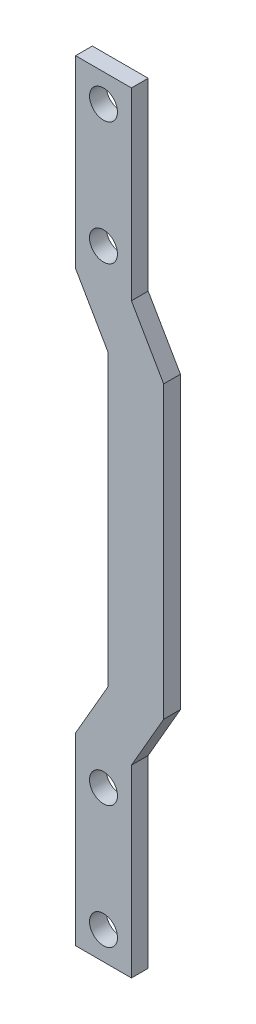
ISO-10303-21;
HEADER;
FILE_DESCRIPTION(('STEP AP214'),'2;1');
FILE_NAME('part.step','',(''),(''),'','','');
FILE_SCHEMA(('AUTOMOTIVE_DESIGN { 1 0 10303 214 1 1 1 1 }'));
ENDSEC;
DATA;
#1=APPLICATION_CONTEXT('core data for automotive mechanical design processes');
#2=APPLICATION_PROTOCOL_DEFINITION('international standard','automotive_design',2000,#1);
#3=PRODUCT_CONTEXT('',#1,'mechanical');
#4=PRODUCT('Part','Part','',(#3));
#5=PRODUCT_RELATED_PRODUCT_CATEGORY('part','',(#4));
#6=PRODUCT_DEFINITION_FORMATION('','',#4);
#7=PRODUCT_DEFINITION_CONTEXT('part definition',#1,'design');
#8=PRODUCT_DEFINITION('design','',#6,#7);
#9=PRODUCT_DEFINITION_SHAPE('','',#8);
#10=(LENGTH_UNIT() NAMED_UNIT(*) SI_UNIT(.MILLI.,.METRE.));
#11=(NAMED_UNIT(*) PLANE_ANGLE_UNIT() SI_UNIT($,.RADIAN.));
#12=(NAMED_UNIT(*) SI_UNIT($,.STERADIAN.) SOLID_ANGLE_UNIT());
#13=UNCERTAINTY_MEASURE_WITH_UNIT(LENGTH_MEASURE(1.E-05),#10,'distance_accuracy_value','');
#14=(GEOMETRIC_REPRESENTATION_CONTEXT(3) GLOBAL_UNCERTAINTY_ASSIGNED_CONTEXT((#13)) GLOBAL_UNIT_ASSIGNED_CONTEXT((#10,
#11,#12)) REPRESENTATION_CONTEXT('',''));
#15=CARTESIAN_POINT('',(0.,0.,0.));
#16=DIRECTION('',(0.,0.,1.));
#17=DIRECTION('',(1.,0.,0.));
#18=AXIS2_PLACEMENT_3D('',#15,#16,#17);
#19=CARTESIAN_POINT('',(0.,0.,3.));
#20=DIRECTION('',(0.,0.,1.));
#21=DIRECTION('',(1.,0.,0.));
#22=AXIS2_PLACEMENT_3D('',#19,#20,#21);
#23=PLANE('',#22);
#24=CARTESIAN_POINT('',(-105.080131723381,-47.7357142857143,3.));
#25=DIRECTION('',(0.,0.,1.));
#26=DIRECTION('',(-1.,0.,0.));
#27=AXIS2_PLACEMENT_3D('',#24,#25,#26);
#28=CIRCLE('',#27,2.5);
#29=CARTESIAN_POINT('',(-107.580131723381,-47.7357142857143,3.));
#30=VERTEX_POINT('',#29);
#31=EDGE_CURVE('E290',#30,#30,#28,.T.);
#32=ORIENTED_EDGE('',*,*,#31,.F.);
#33=EDGE_LOOP('',(#32));
#34=FACE_BOUND('',#33,.T.);
#35=CARTESIAN_POINT('',(-105.080131723381,58.2642857142857,3.));
#36=DIRECTION('',(0.,0.,1.));
#37=DIRECTION('',(1.,0.,0.));
#38=AXIS2_PLACEMENT_3D('',#35,#36,#37);
#39=CIRCLE('',#38,2.5);
#40=CARTESIAN_POINT('',(-102.580131723381,58.2642857142857,3.));
#41=VERTEX_POINT('',#40);
#42=EDGE_CURVE('E157',#41,#41,#39,.T.);
#43=ORIENTED_EDGE('',*,*,#42,.F.);
#44=EDGE_LOOP('',(#43));
#45=FACE_BOUND('',#44,.T.);
#46=DIRECTION('',(-0.499999999999999,0.866025403784439,0.));
#47=VECTOR('',#46,1.);
#48=CARTESIAN_POINT('',(-100.080131723381,30.2642857142857,3.));
#49=LINE('',#48,#47);
#50=CARTESIAN_POINT('',(-94.3066290314847,20.2642857142857,3.));
#51=VERTEX_POINT('',#50);
#52=CARTESIAN_POINT('',(-100.080131723381,30.2642857142857,3.));
#53=VERTEX_POINT('',#52);
#54=EDGE_CURVE('E176',#51,#53,#49,.T.);
#55=ORIENTED_EDGE('',*,*,#54,.T.);
#56=DIRECTION('',(0.,1.,0.));
#57=VECTOR('',#56,1.);
#58=CARTESIAN_POINT('',(-100.080131723381,30.2642857142857,3.));
#59=LINE('',#58,#57);
#60=CARTESIAN_POINT('',(-100.080131723381,63.2642857142857,3.));
#61=VERTEX_POINT('',#60);
#62=EDGE_CURVE('E104',#53,#61,#59,.T.);
#63=ORIENTED_EDGE('',*,*,#62,.T.);
#64=DIRECTION('',(-1.,0.,0.));
#65=VECTOR('',#64,1.);
#66=CARTESIAN_POINT('',(-100.080131723381,63.2642857142857,3.));
#67=LINE('',#66,#65);
#68=CARTESIAN_POINT('',(-110.080131723381,63.2642857142857,3.));
#69=VERTEX_POINT('',#68);
#70=EDGE_CURVE('E203',#61,#69,#67,.T.);
#71=ORIENTED_EDGE('',*,*,#70,.T.);
#72=DIRECTION('',(0.,-1.,0.));
#73=VECTOR('',#72,1.);
#74=CARTESIAN_POINT('',(-110.080131723381,30.2642857142857,3.));
#75=LINE('',#74,#73);
#76=CARTESIAN_POINT('',(-110.080131723381,30.2642857142857,3.));
#77=VERTEX_POINT('',#76);
#78=EDGE_CURVE('E222',#69,#77,#75,.T.);
#79=ORIENTED_EDGE('',*,*,#78,.T.);
#80=DIRECTION('',(0.499999999999995,-0.866025403784442,0.));
#81=VECTOR('',#80,1.);
#82=CARTESIAN_POINT('',(-110.080131723381,30.2642857142857,3.));
#83=LINE('',#82,#81);
#84=CARTESIAN_POINT('',(-104.306629031485,20.2642857142857,3.));
#85=VERTEX_POINT('',#84);
#86=EDGE_CURVE('E219',#77,#85,#83,.T.);
#87=ORIENTED_EDGE('',*,*,#86,.T.);
#88=DIRECTION('',(0.,-1.,0.));
#89=VECTOR('',#88,1.);
#90=CARTESIAN_POINT('',(-104.306629031485,20.2642857142857,3.));
#91=LINE('',#90,#89);
#92=CARTESIAN_POINT('',(-104.306629031485,-31.7357142857143,3.));
#93=VERTEX_POINT('',#92);
#94=EDGE_CURVE('E221',#85,#93,#91,.T.);
#95=ORIENTED_EDGE('',*,*,#94,.T.);
#96=DIRECTION('',(-0.499999999999995,-0.866025403784442,0.));
#97=VECTOR('',#96,1.);
#98=CARTESIAN_POINT('',(-110.080131723381,-41.7357142857143,3.));
#99=LINE('',#98,#97);
#100=CARTESIAN_POINT('',(-110.080131723381,-41.7357142857143,3.));
#101=VERTEX_POINT('',#100);
#102=EDGE_CURVE('E224',#93,#101,#99,.T.);
#103=ORIENTED_EDGE('',*,*,#102,.T.);
#104=DIRECTION('',(0.,-1.,0.));
#105=VECTOR('',#104,1.);
#106=CARTESIAN_POINT('',(-110.080131723381,-41.7357142857143,3.));
#107=LINE('',#106,#105);
#108=CARTESIAN_POINT('',(-110.080131723381,-74.7357142857143,3.));
#109=VERTEX_POINT('',#108);
#110=EDGE_CURVE('E230',#101,#109,#107,.T.);
#111=ORIENTED_EDGE('',*,*,#110,.T.);
#112=DIRECTION('',(1.,0.,0.));
#113=VECTOR('',#112,1.);
#114=CARTESIAN_POINT('',(-100.080131723381,-74.7357142857143,3.));
#115=LINE('',#114,#113);
#116=CARTESIAN_POINT('',(-100.080131723381,-74.7357142857143,3.));
#117=VERTEX_POINT('',#116);
#118=EDGE_CURVE('E135',#109,#117,#115,.T.);
#119=ORIENTED_EDGE('',*,*,#118,.T.);
#120=DIRECTION('',(0.,1.,0.));
#121=VECTOR('',#120,1.);
#122=CARTESIAN_POINT('',(-100.080131723381,-41.7357142857143,3.));
#123=LINE('',#122,#121);
#124=CARTESIAN_POINT('',(-100.080131723381,-41.7357142857143,3.));
#125=VERTEX_POINT('',#124);
#126=EDGE_CURVE('E129',#117,#125,#123,.T.);
#127=ORIENTED_EDGE('',*,*,#126,.T.);
#128=DIRECTION('',(0.499999999999995,0.866025403784442,0.));
#129=VECTOR('',#128,1.);
#130=CARTESIAN_POINT('',(-100.080131723381,-41.7357142857143,3.));
#131=LINE('',#130,#129);
#132=CARTESIAN_POINT('',(-94.3066290314847,-31.7357142857143,3.));
#133=VERTEX_POINT('',#132);
#134=EDGE_CURVE('E133',#125,#133,#131,.T.);
#135=ORIENTED_EDGE('',*,*,#134,.T.);
#136=DIRECTION('',(0.,1.,0.));
#137=VECTOR('',#136,1.);
#138=CARTESIAN_POINT('',(-94.3066290314847,20.2642857142857,3.));
#139=LINE('',#138,#137);
#140=EDGE_CURVE('E49',#133,#51,#139,.T.);
#141=ORIENTED_EDGE('',*,*,#140,.T.);
#142=EDGE_LOOP('',(#55,#63,#71,#79,#87,#95,#103,#111,#119,#127,#135,#141));
#143=FACE_BOUND('',#142,.T.);
#144=CARTESIAN_POINT('',(-105.080131723381,36.2642857142857,3.));
#145=DIRECTION('',(0.,0.,1.));
#146=DIRECTION('',(1.,0.,0.));
#147=AXIS2_PLACEMENT_3D('',#144,#145,#146);
#148=CIRCLE('',#147,2.5);
#149=CARTESIAN_POINT('',(-102.580131723381,36.2642857142857,3.));
#150=VERTEX_POINT('',#149);
#151=EDGE_CURVE('E296',#150,#150,#148,.T.);
#152=ORIENTED_EDGE('',*,*,#151,.F.);
#153=EDGE_LOOP('',(#152));
#154=FACE_BOUND('',#153,.T.);
#155=CARTESIAN_POINT('',(-105.080131723381,-69.7357142857143,3.));
#156=DIRECTION('',(0.,0.,1.));
#157=DIRECTION('',(-1.,0.,0.));
#158=AXIS2_PLACEMENT_3D('',#155,#156,#157);
#159=CIRCLE('',#158,2.5);
#160=CARTESIAN_POINT('',(-107.580131723381,-69.7357142857143,3.));
#161=VERTEX_POINT('',#160);
#162=EDGE_CURVE('E281',#161,#161,#159,.T.);
#163=ORIENTED_EDGE('',*,*,#162,.F.);
#164=EDGE_LOOP('',(#163));
#165=FACE_BOUND('',#164,.T.);
#166=ADVANCED_FACE('F32',(#34,#45,#143,#154,#165),#23,.T.);
#167=CARTESIAN_POINT('',(0.,0.,0.));
#168=DIRECTION('',(0.,0.,1.));
#169=DIRECTION('',(1.,0.,0.));
#170=AXIS2_PLACEMENT_3D('',#167,#168,#169);
#171=PLANE('',#170);
#172=DIRECTION('',(-0.499999999999999,0.866025403784439,0.));
#173=VECTOR('',#172,1.);
#174=CARTESIAN_POINT('',(-100.080131723381,30.2642857142857,0.));
#175=LINE('',#174,#173);
#176=CARTESIAN_POINT('',(-94.3066290314847,20.2642857142857,0.));
#177=VERTEX_POINT('',#176);
#178=CARTESIAN_POINT('',(-100.080131723381,30.2642857142857,0.));
#179=VERTEX_POINT('',#178);
#180=EDGE_CURVE('E153',#177,#179,#175,.T.);
#181=ORIENTED_EDGE('',*,*,#180,.F.);
#182=DIRECTION('',(0.,1.,0.));
#183=VECTOR('',#182,1.);
#184=CARTESIAN_POINT('',(-94.3066290314847,20.2642857142857,0.));
#185=LINE('',#184,#183);
#186=CARTESIAN_POINT('',(-94.3066290314847,-31.7357142857143,0.));
#187=VERTEX_POINT('',#186);
#188=EDGE_CURVE('E96',#187,#177,#185,.T.);
#189=ORIENTED_EDGE('',*,*,#188,.F.);
#190=DIRECTION('',(0.499999999999995,0.866025403784442,0.));
#191=VECTOR('',#190,1.);
#192=CARTESIAN_POINT('',(-100.080131723381,-41.7357142857143,0.));
#193=LINE('',#192,#191);
#194=CARTESIAN_POINT('',(-100.080131723381,-41.7357142857143,0.));
#195=VERTEX_POINT('',#194);
#196=EDGE_CURVE('E90',#195,#187,#193,.T.);
#197=ORIENTED_EDGE('',*,*,#196,.F.);
#198=DIRECTION('',(0.,1.,0.));
#199=VECTOR('',#198,1.);
#200=CARTESIAN_POINT('',(-100.080131723381,-41.7357142857143,0.));
#201=LINE('',#200,#199);
#202=CARTESIAN_POINT('',(-100.080131723381,-74.7357142857143,0.));
#203=VERTEX_POINT('',#202);
#204=EDGE_CURVE('E143',#203,#195,#201,.T.);
#205=ORIENTED_EDGE('',*,*,#204,.F.);
#206=DIRECTION('',(1.,0.,0.));
#207=VECTOR('',#206,1.);
#208=CARTESIAN_POINT('',(-100.080131723381,-74.7357142857143,0.));
#209=LINE('',#208,#207);
#210=CARTESIAN_POINT('',(-110.080131723381,-74.7357142857143,0.));
#211=VERTEX_POINT('',#210);
#212=EDGE_CURVE('E171',#211,#203,#209,.T.);
#213=ORIENTED_EDGE('',*,*,#212,.F.);
#214=DIRECTION('',(0.,-1.,0.));
#215=VECTOR('',#214,1.);
#216=CARTESIAN_POINT('',(-110.080131723381,-41.7357142857143,0.));
#217=LINE('',#216,#215);
#218=CARTESIAN_POINT('',(-110.080131723381,-41.7357142857143,0.));
#219=VERTEX_POINT('',#218);
#220=EDGE_CURVE('E169',#219,#211,#217,.T.);
#221=ORIENTED_EDGE('',*,*,#220,.F.);
#222=DIRECTION('',(-0.499999999999995,-0.866025403784442,0.));
#223=VECTOR('',#222,1.);
#224=CARTESIAN_POINT('',(-110.080131723381,-41.7357142857143,0.));
#225=LINE('',#224,#223);
#226=CARTESIAN_POINT('',(-104.306629031485,-31.7357142857143,0.));
#227=VERTEX_POINT('',#226);
#228=EDGE_CURVE('E167',#227,#219,#225,.T.);
#229=ORIENTED_EDGE('',*,*,#228,.F.);
#230=DIRECTION('',(0.,-1.,0.));
#231=VECTOR('',#230,1.);
#232=CARTESIAN_POINT('',(-104.306629031485,20.2642857142857,0.));
#233=LINE('',#232,#231);
#234=CARTESIAN_POINT('',(-104.306629031485,20.2642857142857,0.));
#235=VERTEX_POINT('',#234);
#236=EDGE_CURVE('E165',#235,#227,#233,.T.);
#237=ORIENTED_EDGE('',*,*,#236,.F.);
#238=DIRECTION('',(0.499999999999995,-0.866025403784442,0.));
#239=VECTOR('',#238,1.);
#240=CARTESIAN_POINT('',(-110.080131723381,30.2642857142857,0.));
#241=LINE('',#240,#239);
#242=CARTESIAN_POINT('',(-110.080131723381,30.2642857142857,0.));
#243=VERTEX_POINT('',#242);
#244=EDGE_CURVE('E163',#243,#235,#241,.T.);
#245=ORIENTED_EDGE('',*,*,#244,.F.);
#246=DIRECTION('',(0.,-1.,0.));
#247=VECTOR('',#246,1.);
#248=CARTESIAN_POINT('',(-110.080131723381,30.2642857142857,0.));
#249=LINE('',#248,#247);
#250=CARTESIAN_POINT('',(-110.080131723381,63.2642857142857,0.));
#251=VERTEX_POINT('',#250);
#252=EDGE_CURVE('E161',#251,#243,#249,.T.);
#253=ORIENTED_EDGE('',*,*,#252,.F.);
#254=DIRECTION('',(-1.,0.,0.));
#255=VECTOR('',#254,1.);
#256=CARTESIAN_POINT('',(-100.080131723381,63.2642857142857,0.));
#257=LINE('',#256,#255);
#258=CARTESIAN_POINT('',(-100.080131723381,63.2642857142857,0.));
#259=VERTEX_POINT('',#258);
#260=EDGE_CURVE('E159',#259,#251,#257,.T.);
#261=ORIENTED_EDGE('',*,*,#260,.F.);
#262=DIRECTION('',(0.,1.,0.));
#263=VECTOR('',#262,1.);
#264=CARTESIAN_POINT('',(-100.080131723381,30.2642857142857,0.));
#265=LINE('',#264,#263);
#266=EDGE_CURVE('E156',#179,#259,#265,.T.);
#267=ORIENTED_EDGE('',*,*,#266,.F.);
#268=EDGE_LOOP('',(#181,#189,#197,#205,#213,#221,#229,#237,#245,#253,#261,#267));
#269=FACE_BOUND('',#268,.T.);
#270=CARTESIAN_POINT('',(-105.080131723381,58.2642857142857,0.));
#271=DIRECTION('',(0.,0.,1.));
#272=DIRECTION('',(1.,0.,0.));
#273=AXIS2_PLACEMENT_3D('',#270,#271,#272);
#274=CIRCLE('',#273,2.5);
#275=CARTESIAN_POINT('',(-102.580131723381,58.2642857142857,0.));
#276=VERTEX_POINT('',#275);
#277=EDGE_CURVE('E299',#276,#276,#274,.T.);
#278=ORIENTED_EDGE('',*,*,#277,.T.);
#279=EDGE_LOOP('',(#278));
#280=FACE_BOUND('',#279,.T.);
#281=CARTESIAN_POINT('',(-105.080131723381,36.2642857142857,0.));
#282=DIRECTION('',(0.,0.,1.));
#283=DIRECTION('',(1.,0.,0.));
#284=AXIS2_PLACEMENT_3D('',#281,#282,#283);
#285=CIRCLE('',#284,2.5);
#286=CARTESIAN_POINT('',(-102.580131723381,36.2642857142857,0.));
#287=VERTEX_POINT('',#286);
#288=EDGE_CURVE('E293',#287,#287,#285,.T.);
#289=ORIENTED_EDGE('',*,*,#288,.T.);
#290=EDGE_LOOP('',(#289));
#291=FACE_BOUND('',#290,.T.);
#292=CARTESIAN_POINT('',(-105.080131723381,-47.7357142857143,0.));
#293=DIRECTION('',(0.,0.,1.));
#294=DIRECTION('',(-1.,0.,0.));
#295=AXIS2_PLACEMENT_3D('',#292,#293,#294);
#296=CIRCLE('',#295,2.5);
#297=CARTESIAN_POINT('',(-107.580131723381,-47.7357142857143,0.));
#298=VERTEX_POINT('',#297);
#299=EDGE_CURVE('E287',#298,#298,#296,.T.);
#300=ORIENTED_EDGE('',*,*,#299,.T.);
#301=EDGE_LOOP('',(#300));
#302=FACE_BOUND('',#301,.T.);
#303=CARTESIAN_POINT('',(-105.080131723381,-69.7357142857143,0.));
#304=DIRECTION('',(0.,0.,1.));
#305=DIRECTION('',(-1.,0.,0.));
#306=AXIS2_PLACEMENT_3D('',#303,#304,#305);
#307=CIRCLE('',#306,2.5);
#308=CARTESIAN_POINT('',(-107.580131723381,-69.7357142857143,0.));
#309=VERTEX_POINT('',#308);
#310=EDGE_CURVE('E284',#309,#309,#307,.T.);
#311=ORIENTED_EDGE('',*,*,#310,.T.);
#312=EDGE_LOOP('',(#311));
#313=FACE_BOUND('',#312,.T.);
#314=ADVANCED_FACE('F207',(#269,#280,#291,#302,#313),#171,.F.);
#315=CARTESIAN_POINT('',(-100.080131723381,30.2642857142857,3.));
#316=DIRECTION('',(-0.866025403784439,-0.499999999999999,0.));
#317=DIRECTION('',(0.499999999999999,-0.866025403784439,0.));
#318=AXIS2_PLACEMENT_3D('',#315,#316,#317);
#319=PLANE('',#318);
#320=ORIENTED_EDGE('',*,*,#180,.T.);
#321=DIRECTION('',(0.,0.,-1.));
#322=VECTOR('',#321,1.);
#323=CARTESIAN_POINT('',(-100.080131723381,30.2642857142857,3.));
#324=LINE('',#323,#322);
#325=EDGE_CURVE('E11',#53,#179,#324,.T.);
#326=ORIENTED_EDGE('',*,*,#325,.F.);
#327=ORIENTED_EDGE('',*,*,#54,.F.);
#328=DIRECTION('',(0.,0.,-1.));
#329=VECTOR('',#328,1.);
#330=CARTESIAN_POINT('',(-94.3066290314847,20.2642857142857,3.));
#331=LINE('',#330,#329);
#332=EDGE_CURVE('E149',#51,#177,#331,.T.);
#333=ORIENTED_EDGE('',*,*,#332,.T.);
#334=EDGE_LOOP('',(#320,#326,#327,#333));
#335=FACE_BOUND('',#334,.T.);
#336=ADVANCED_FACE('F34',(#335),#319,.F.);
#337=CARTESIAN_POINT('',(-100.080131723381,30.2642857142857,3.));
#338=DIRECTION('',(-1.,0.,0.));
#339=DIRECTION('',(0.,-1.,0.));
#340=AXIS2_PLACEMENT_3D('',#337,#338,#339);
#341=PLANE('',#340);
#342=ORIENTED_EDGE('',*,*,#266,.T.);
#343=DIRECTION('',(0.,0.,-1.));
#344=VECTOR('',#343,1.);
#345=CARTESIAN_POINT('',(-100.080131723381,63.2642857142857,3.));
#346=LINE('',#345,#344);
#347=EDGE_CURVE('E41',#61,#259,#346,.T.);
#348=ORIENTED_EDGE('',*,*,#347,.F.);
#349=ORIENTED_EDGE('',*,*,#62,.F.);
#350=ORIENTED_EDGE('',*,*,#325,.T.);
#351=EDGE_LOOP('',(#342,#348,#349,#350));
#352=FACE_BOUND('',#351,.T.);
#353=ADVANCED_FACE('F409',(#352),#341,.F.);
#354=CARTESIAN_POINT('',(-100.080131723381,63.2642857142857,3.));
#355=DIRECTION('',(0.,-1.,0.));
#356=DIRECTION('',(1.,0.,0.));
#357=AXIS2_PLACEMENT_3D('',#354,#355,#356);
#358=PLANE('',#357);
#359=ORIENTED_EDGE('',*,*,#260,.T.);
#360=DIRECTION('',(0.,0.,-1.));
#361=VECTOR('',#360,1.);
#362=CARTESIAN_POINT('',(-110.080131723381,63.2642857142857,3.));
#363=LINE('',#362,#361);
#364=EDGE_CURVE('E195',#69,#251,#363,.T.);
#365=ORIENTED_EDGE('',*,*,#364,.F.);
#366=ORIENTED_EDGE('',*,*,#70,.F.);
#367=ORIENTED_EDGE('',*,*,#347,.T.);
#368=EDGE_LOOP('',(#359,#365,#366,#367));
#369=FACE_BOUND('',#368,.T.);
#370=ADVANCED_FACE('F201',(#369),#358,.F.);
#371=CARTESIAN_POINT('',(-110.080131723381,30.2642857142857,3.));
#372=DIRECTION('',(1.,0.,0.));
#373=DIRECTION('',(0.,1.,0.));
#374=AXIS2_PLACEMENT_3D('',#371,#372,#373);
#375=PLANE('',#374);
#376=ORIENTED_EDGE('',*,*,#252,.T.);
#377=DIRECTION('',(0.,0.,-1.));
#378=VECTOR('',#377,1.);
#379=CARTESIAN_POINT('',(-110.080131723381,30.2642857142857,3.));
#380=LINE('',#379,#378);
#381=EDGE_CURVE('E192',#77,#243,#380,.T.);
#382=ORIENTED_EDGE('',*,*,#381,.F.);
#383=ORIENTED_EDGE('',*,*,#78,.F.);
#384=ORIENTED_EDGE('',*,*,#364,.T.);
#385=EDGE_LOOP('',(#376,#382,#383,#384));
#386=FACE_BOUND('',#385,.T.);
#387=ADVANCED_FACE('F213',(#386),#375,.F.);
#388=CARTESIAN_POINT('',(-110.080131723381,30.2642857142857,3.));
#389=DIRECTION('',(0.866025403784441,0.499999999999995,0.));
#390=DIRECTION('',(-0.499999999999995,0.866025403784442,0.));
#391=AXIS2_PLACEMENT_3D('',#388,#389,#390);
#392=PLANE('',#391);
#393=ORIENTED_EDGE('',*,*,#244,.T.);
#394=DIRECTION('',(0.,0.,-1.));
#395=VECTOR('',#394,1.);
#396=CARTESIAN_POINT('',(-104.306629031485,20.2642857142857,3.));
#397=LINE('',#396,#395);
#398=EDGE_CURVE('E189',#85,#235,#397,.T.);
#399=ORIENTED_EDGE('',*,*,#398,.F.);
#400=ORIENTED_EDGE('',*,*,#86,.F.);
#401=ORIENTED_EDGE('',*,*,#381,.T.);
#402=EDGE_LOOP('',(#393,#399,#400,#401));
#403=FACE_BOUND('',#402,.T.);
#404=ADVANCED_FACE('F217',(#403),#392,.F.);
#405=CARTESIAN_POINT('',(-104.306629031485,20.2642857142857,3.));
#406=DIRECTION('',(1.,0.,0.));
#407=DIRECTION('',(0.,0.,-1.));
#408=AXIS2_PLACEMENT_3D('',#405,#406,#407);
#409=PLANE('',#408);
#410=ORIENTED_EDGE('',*,*,#236,.T.);
#411=DIRECTION('',(0.,0.,-1.));
#412=VECTOR('',#411,1.);
#413=CARTESIAN_POINT('',(-104.306629031485,-31.7357142857143,3.));
#414=LINE('',#413,#412);
#415=EDGE_CURVE('E186',#93,#227,#414,.T.);
#416=ORIENTED_EDGE('',*,*,#415,.F.);
#417=ORIENTED_EDGE('',*,*,#94,.F.);
#418=ORIENTED_EDGE('',*,*,#398,.T.);
#419=EDGE_LOOP('',(#410,#416,#417,#418));
#420=FACE_BOUND('',#419,.T.);
#421=ADVANCED_FACE('F374',(#420),#409,.F.);
#422=CARTESIAN_POINT('',(-110.080131723381,-41.7357142857143,3.));
#423=DIRECTION('',(0.866025403784442,-0.499999999999995,0.));
#424=DIRECTION('',(0.499999999999995,0.866025403784442,0.));
#425=AXIS2_PLACEMENT_3D('',#422,#423,#424);
#426=PLANE('',#425);
#427=ORIENTED_EDGE('',*,*,#228,.T.);
#428=DIRECTION('',(0.,0.,-1.));
#429=VECTOR('',#428,1.);
#430=CARTESIAN_POINT('',(-110.080131723381,-41.7357142857143,3.));
#431=LINE('',#430,#429);
#432=EDGE_CURVE('E183',#101,#219,#431,.T.);
#433=ORIENTED_EDGE('',*,*,#432,.F.);
#434=ORIENTED_EDGE('',*,*,#102,.F.);
#435=ORIENTED_EDGE('',*,*,#415,.T.);
#436=EDGE_LOOP('',(#427,#433,#434,#435));
#437=FACE_BOUND('',#436,.T.);
#438=ADVANCED_FACE('F365',(#437),#426,.F.);
#439=CARTESIAN_POINT('',(-110.080131723381,-41.7357142857143,3.));
#440=DIRECTION('',(1.,0.,0.));
#441=DIRECTION('',(0.,0.,-1.));
#442=AXIS2_PLACEMENT_3D('',#439,#440,#441);
#443=PLANE('',#442);
#444=ORIENTED_EDGE('',*,*,#220,.T.);
#445=DIRECTION('',(0.,0.,-1.));
#446=VECTOR('',#445,1.);
#447=CARTESIAN_POINT('',(-110.080131723381,-74.7357142857143,3.));
#448=LINE('',#447,#446);
#449=EDGE_CURVE('E180',#109,#211,#448,.T.);
#450=ORIENTED_EDGE('',*,*,#449,.F.);
#451=ORIENTED_EDGE('',*,*,#110,.F.);
#452=ORIENTED_EDGE('',*,*,#432,.T.);
#453=EDGE_LOOP('',(#444,#450,#451,#452));
#454=FACE_BOUND('',#453,.T.);
#455=ADVANCED_FACE('F236',(#454),#443,.F.);
#456=CARTESIAN_POINT('',(-100.080131723381,-74.7357142857143,3.));
#457=DIRECTION('',(0.,1.,0.));
#458=DIRECTION('',(0.,0.,1.));
#459=AXIS2_PLACEMENT_3D('',#456,#457,#458);
#460=PLANE('',#459);
#461=ORIENTED_EDGE('',*,*,#212,.T.);
#462=DIRECTION('',(0.,0.,-1.));
#463=VECTOR('',#462,1.);
#464=CARTESIAN_POINT('',(-100.080131723381,-74.7357142857143,3.));
#465=LINE('',#464,#463);
#466=EDGE_CURVE('E144',#117,#203,#465,.T.);
#467=ORIENTED_EDGE('',*,*,#466,.F.);
#468=ORIENTED_EDGE('',*,*,#118,.F.);
#469=ORIENTED_EDGE('',*,*,#449,.T.);
#470=EDGE_LOOP('',(#461,#467,#468,#469));
#471=FACE_BOUND('',#470,.T.);
#472=ADVANCED_FACE('F240',(#471),#460,.F.);
#473=CARTESIAN_POINT('',(-100.080131723381,-41.7357142857143,3.));
#474=DIRECTION('',(-1.,0.,0.));
#475=DIRECTION('',(0.,0.,1.));
#476=AXIS2_PLACEMENT_3D('',#473,#474,#475);
#477=PLANE('',#476);
#478=ORIENTED_EDGE('',*,*,#204,.T.);
#479=DIRECTION('',(0.,0.,-1.));
#480=VECTOR('',#479,1.);
#481=CARTESIAN_POINT('',(-100.080131723381,-41.7357142857143,3.));
#482=LINE('',#481,#480);
#483=EDGE_CURVE('E140',#125,#195,#482,.T.);
#484=ORIENTED_EDGE('',*,*,#483,.F.);
#485=ORIENTED_EDGE('',*,*,#126,.F.);
#486=ORIENTED_EDGE('',*,*,#466,.T.);
#487=EDGE_LOOP('',(#478,#484,#485,#486));
#488=FACE_BOUND('',#487,.T.);
#489=ADVANCED_FACE('F141',(#488),#477,.F.);
#490=CARTESIAN_POINT('',(-100.080131723381,-41.7357142857143,3.));
#491=DIRECTION('',(-0.866025403784441,0.499999999999995,0.));
#492=DIRECTION('',(-0.499999999999995,-0.866025403784442,0.));
#493=AXIS2_PLACEMENT_3D('',#490,#491,#492);
#494=PLANE('',#493);
#495=ORIENTED_EDGE('',*,*,#196,.T.);
#496=DIRECTION('',(0.,0.,-1.));
#497=VECTOR('',#496,1.);
#498=CARTESIAN_POINT('',(-94.3066290314847,-31.7357142857143,3.));
#499=LINE('',#498,#497);
#500=EDGE_CURVE('E145',#133,#187,#499,.T.);
#501=ORIENTED_EDGE('',*,*,#500,.F.);
#502=ORIENTED_EDGE('',*,*,#134,.F.);
#503=ORIENTED_EDGE('',*,*,#483,.T.);
#504=EDGE_LOOP('',(#495,#501,#502,#503));
#505=FACE_BOUND('',#504,.T.);
#506=ADVANCED_FACE('F147',(#505),#494,.F.);
#507=CARTESIAN_POINT('',(-94.3066290314847,20.2642857142857,3.));
#508=DIRECTION('',(-1.,0.,0.));
#509=DIRECTION('',(0.,-1.,0.));
#510=AXIS2_PLACEMENT_3D('',#507,#508,#509);
#511=PLANE('',#510);
#512=ORIENTED_EDGE('',*,*,#188,.T.);
#513=ORIENTED_EDGE('',*,*,#332,.F.);
#514=ORIENTED_EDGE('',*,*,#140,.F.);
#515=ORIENTED_EDGE('',*,*,#500,.T.);
#516=EDGE_LOOP('',(#512,#513,#514,#515));
#517=FACE_BOUND('',#516,.T.);
#518=ADVANCED_FACE('F244',(#517),#511,.F.);
#519=CARTESIAN_POINT('',(-105.080131723381,58.2642857142857,3.));
#520=DIRECTION('',(0.,0.,-1.));
#521=DIRECTION('',(-1.,0.,0.));
#522=AXIS2_PLACEMENT_3D('',#519,#520,#521);
#523=CYLINDRICAL_SURFACE('',#522,2.5);
#524=ORIENTED_EDGE('',*,*,#42,.T.);
#525=EDGE_LOOP('',(#524));
#526=FACE_BOUND('',#525,.T.);
#527=ORIENTED_EDGE('',*,*,#277,.F.);
#528=EDGE_LOOP('',(#527));
#529=FACE_BOUND('',#528,.T.);
#530=ADVANCED_FACE('F246',(#526,#529),#523,.F.);
#531=CARTESIAN_POINT('',(-105.080131723381,36.2642857142857,3.));
#532=DIRECTION('',(0.,0.,-1.));
#533=DIRECTION('',(-1.,0.,0.));
#534=AXIS2_PLACEMENT_3D('',#531,#532,#533);
#535=CYLINDRICAL_SURFACE('',#534,2.5);
#536=ORIENTED_EDGE('',*,*,#151,.T.);
#537=EDGE_LOOP('',(#536));
#538=FACE_BOUND('',#537,.T.);
#539=ORIENTED_EDGE('',*,*,#288,.F.);
#540=EDGE_LOOP('',(#539));
#541=FACE_BOUND('',#540,.T.);
#542=ADVANCED_FACE('F252',(#538,#541),#535,.F.);
#543=CARTESIAN_POINT('',(-105.080131723381,-47.7357142857143,3.));
#544=DIRECTION('',(0.,0.,-1.));
#545=DIRECTION('',(-1.,0.,0.));
#546=AXIS2_PLACEMENT_3D('',#543,#544,#545);
#547=CYLINDRICAL_SURFACE('',#546,2.5);
#548=ORIENTED_EDGE('',*,*,#31,.T.);
#549=EDGE_LOOP('',(#548));
#550=FACE_BOUND('',#549,.T.);
#551=ORIENTED_EDGE('',*,*,#299,.F.);
#552=EDGE_LOOP('',(#551));
#553=FACE_BOUND('',#552,.T.);
#554=ADVANCED_FACE('F268',(#550,#553),#547,.F.);
#555=CARTESIAN_POINT('',(-105.080131723381,-69.7357142857143,3.));
#556=DIRECTION('',(0.,0.,-1.));
#557=DIRECTION('',(-1.,0.,0.));
#558=AXIS2_PLACEMENT_3D('',#555,#556,#557);
#559=CYLINDRICAL_SURFACE('',#558,2.5);
#560=ORIENTED_EDGE('',*,*,#162,.T.);
#561=EDGE_LOOP('',(#560));
#562=FACE_BOUND('',#561,.T.);
#563=ORIENTED_EDGE('',*,*,#310,.F.);
#564=EDGE_LOOP('',(#563));
#565=FACE_BOUND('',#564,.T.);
#566=ADVANCED_FACE('F272',(#562,#565),#559,.F.);
#567=CLOSED_SHELL('',(#166,#314,#336,#353,#370,#387,#404,#421,#438,#455,#472,#489,#506,#518,
#530,#542,#554,#566));
#568=MANIFOLD_SOLID_BREP('B2',#567);
#569=ADVANCED_BREP_SHAPE_REPRESENTATION('',(#18,#568),#14);
#570=SHAPE_DEFINITION_REPRESENTATION(#9,#569);
ENDSEC;
END-ISO-10303-21;
